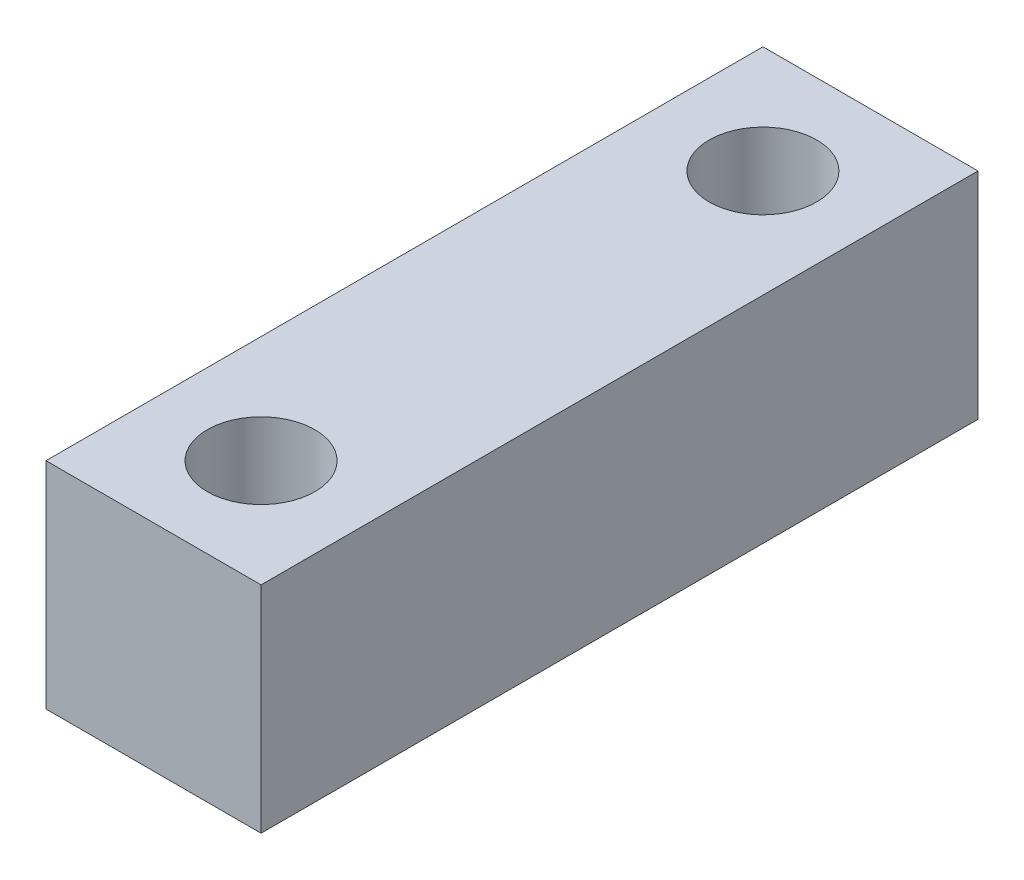
ISO-10303-21;
HEADER;
FILE_DESCRIPTION(('STEP AP214'),'2;1');
FILE_NAME('part.step','',(''),(''),'','','');
FILE_SCHEMA(('AUTOMOTIVE_DESIGN { 1 0 10303 214 1 1 1 1 }'));
ENDSEC;
DATA;
#1=APPLICATION_CONTEXT('core data for automotive mechanical design processes');
#2=APPLICATION_PROTOCOL_DEFINITION('international standard','automotive_design',2000,#1);
#3=PRODUCT_CONTEXT('',#1,'mechanical');
#4=PRODUCT('Part','Part','',(#3));
#5=PRODUCT_RELATED_PRODUCT_CATEGORY('part','',(#4));
#6=PRODUCT_DEFINITION_FORMATION('','',#4);
#7=PRODUCT_DEFINITION_CONTEXT('part definition',#1,'design');
#8=PRODUCT_DEFINITION('design','',#6,#7);
#9=PRODUCT_DEFINITION_SHAPE('','',#8);
#10=(LENGTH_UNIT() NAMED_UNIT(*) SI_UNIT(.MILLI.,.METRE.));
#11=(NAMED_UNIT(*) PLANE_ANGLE_UNIT() SI_UNIT($,.RADIAN.));
#12=(NAMED_UNIT(*) SI_UNIT($,.STERADIAN.) SOLID_ANGLE_UNIT());
#13=UNCERTAINTY_MEASURE_WITH_UNIT(LENGTH_MEASURE(1.E-05),#10,'distance_accuracy_value','');
#14=(GEOMETRIC_REPRESENTATION_CONTEXT(3) GLOBAL_UNCERTAINTY_ASSIGNED_CONTEXT((#13)) GLOBAL_UNIT_ASSIGNED_CONTEXT((#10,
#11,#12)) REPRESENTATION_CONTEXT('',''));
#15=CARTESIAN_POINT('',(0.,0.,0.));
#16=DIRECTION('',(0.,0.,1.));
#17=DIRECTION('',(1.,0.,0.));
#18=AXIS2_PLACEMENT_3D('',#15,#16,#17);
#19=CARTESIAN_POINT('',(15.,-15.,100.));
#20=DIRECTION('',(-1.,0.,0.));
#21=DIRECTION('',(0.,0.,1.));
#22=AXIS2_PLACEMENT_3D('',#19,#20,#21);
#23=PLANE('',#22);
#24=DIRECTION('',(0.,1.,0.));
#25=VECTOR('',#24,1.);
#26=CARTESIAN_POINT('',(15.,-15.,0.));
#27=LINE('',#26,#25);
#28=CARTESIAN_POINT('',(15.,-15.,0.));
#29=VERTEX_POINT('',#28);
#30=CARTESIAN_POINT('',(15.,15.,0.));
#31=VERTEX_POINT('',#30);
#32=EDGE_CURVE('E110',#29,#31,#27,.T.);
#33=ORIENTED_EDGE('',*,*,#32,.T.);
#34=DIRECTION('',(0.,0.,-1.));
#35=VECTOR('',#34,1.);
#36=CARTESIAN_POINT('',(15.,15.,100.));
#37=LINE('',#36,#35);
#38=CARTESIAN_POINT('',(15.,15.,100.));
#39=VERTEX_POINT('',#38);
#40=EDGE_CURVE('E11',#39,#31,#37,.T.);
#41=ORIENTED_EDGE('',*,*,#40,.F.);
#42=DIRECTION('',(0.,1.,0.));
#43=VECTOR('',#42,1.);
#44=CARTESIAN_POINT('',(15.,-15.,100.));
#45=LINE('',#44,#43);
#46=CARTESIAN_POINT('',(15.,-15.,100.));
#47=VERTEX_POINT('',#46);
#48=EDGE_CURVE('E93',#47,#39,#45,.T.);
#49=ORIENTED_EDGE('',*,*,#48,.F.);
#50=DIRECTION('',(0.,0.,-1.));
#51=VECTOR('',#50,1.);
#52=CARTESIAN_POINT('',(15.,-15.,100.));
#53=LINE('',#52,#51);
#54=EDGE_CURVE('E106',#47,#29,#53,.T.);
#55=ORIENTED_EDGE('',*,*,#54,.T.);
#56=EDGE_LOOP('',(#33,#41,#49,#55));
#57=FACE_BOUND('',#56,.T.);
#58=ADVANCED_FACE('F39',(#57),#23,.F.);
#59=CARTESIAN_POINT('',(-15.,15.,100.));
#60=DIRECTION('',(0.,-1.,0.));
#61=DIRECTION('',(0.,0.,-1.));
#62=AXIS2_PLACEMENT_3D('',#59,#60,#61);
#63=PLANE('',#62);
#64=CARTESIAN_POINT('',(0.,15.,15.));
#65=DIRECTION('',(0.,1.,0.));
#66=DIRECTION('',(0.,0.,1.));
#67=AXIS2_PLACEMENT_3D('',#64,#65,#66);
#68=CIRCLE('',#67,7.5);
#69=CARTESIAN_POINT('',(0.,15.,22.5));
#70=VERTEX_POINT('',#69);
#71=EDGE_CURVE('E126',#70,#70,#68,.T.);
#72=ORIENTED_EDGE('',*,*,#71,.F.);
#73=EDGE_LOOP('',(#72));
#74=FACE_BOUND('',#73,.T.);
#75=CARTESIAN_POINT('',(0.,15.,85.));
#76=DIRECTION('',(0.,1.,0.));
#77=DIRECTION('',(0.,0.,1.));
#78=AXIS2_PLACEMENT_3D('',#75,#76,#77);
#79=CIRCLE('',#78,7.5);
#80=CARTESIAN_POINT('',(0.,15.,92.5));
#81=VERTEX_POINT('',#80);
#82=EDGE_CURVE('E133',#81,#81,#79,.T.);
#83=ORIENTED_EDGE('',*,*,#82,.F.);
#84=EDGE_LOOP('',(#83));
#85=FACE_BOUND('',#84,.T.);
#86=DIRECTION('',(-1.,0.,0.));
#87=VECTOR('',#86,1.);
#88=CARTESIAN_POINT('',(-15.,15.,0.));
#89=LINE('',#88,#87);
#90=CARTESIAN_POINT('',(-15.,15.,0.));
#91=VERTEX_POINT('',#90);
#92=EDGE_CURVE('E98',#31,#91,#89,.T.);
#93=ORIENTED_EDGE('',*,*,#92,.T.);
#94=DIRECTION('',(0.,0.,-1.));
#95=VECTOR('',#94,1.);
#96=CARTESIAN_POINT('',(-15.,15.,100.));
#97=LINE('',#96,#95);
#98=CARTESIAN_POINT('',(-15.,15.,100.));
#99=VERTEX_POINT('',#98);
#100=EDGE_CURVE('E49',#99,#91,#97,.T.);
#101=ORIENTED_EDGE('',*,*,#100,.F.);
#102=DIRECTION('',(-1.,0.,0.));
#103=VECTOR('',#102,1.);
#104=CARTESIAN_POINT('',(-15.,15.,100.));
#105=LINE('',#104,#103);
#106=EDGE_CURVE('E88',#39,#99,#105,.T.);
#107=ORIENTED_EDGE('',*,*,#106,.F.);
#108=ORIENTED_EDGE('',*,*,#40,.T.);
#109=EDGE_LOOP('',(#93,#101,#107,#108));
#110=FACE_BOUND('',#109,.T.);
#111=ADVANCED_FACE('F97',(#74,#85,#110),#63,.F.);
#112=CARTESIAN_POINT('',(-15.,-15.,100.));
#113=DIRECTION('',(1.,0.,0.));
#114=DIRECTION('',(0.,0.,-1.));
#115=AXIS2_PLACEMENT_3D('',#112,#113,#114);
#116=PLANE('',#115);
#117=DIRECTION('',(0.,-1.,0.));
#118=VECTOR('',#117,1.);
#119=CARTESIAN_POINT('',(-15.,-15.,0.));
#120=LINE('',#119,#118);
#121=CARTESIAN_POINT('',(-15.,-15.,0.));
#122=VERTEX_POINT('',#121);
#123=EDGE_CURVE('E75',#91,#122,#120,.T.);
#124=ORIENTED_EDGE('',*,*,#123,.T.);
#125=DIRECTION('',(0.,0.,-1.));
#126=VECTOR('',#125,1.);
#127=CARTESIAN_POINT('',(-15.,-15.,100.));
#128=LINE('',#127,#126);
#129=CARTESIAN_POINT('',(-15.,-15.,100.));
#130=VERTEX_POINT('',#129);
#131=EDGE_CURVE('E100',#130,#122,#128,.T.);
#132=ORIENTED_EDGE('',*,*,#131,.F.);
#133=DIRECTION('',(0.,-1.,0.));
#134=VECTOR('',#133,1.);
#135=CARTESIAN_POINT('',(-15.,-15.,100.));
#136=LINE('',#135,#134);
#137=EDGE_CURVE('E91',#99,#130,#136,.T.);
#138=ORIENTED_EDGE('',*,*,#137,.F.);
#139=ORIENTED_EDGE('',*,*,#100,.T.);
#140=EDGE_LOOP('',(#124,#132,#138,#139));
#141=FACE_BOUND('',#140,.T.);
#142=ADVANCED_FACE('F102',(#141),#116,.F.);
#143=CARTESIAN_POINT('',(-15.,-15.,100.));
#144=DIRECTION('',(0.,1.,0.));
#145=DIRECTION('',(0.,0.,1.));
#146=AXIS2_PLACEMENT_3D('',#143,#144,#145);
#147=PLANE('',#146);
#148=CARTESIAN_POINT('',(0.,-15.,15.));
#149=DIRECTION('',(0.,1.,0.));
#150=DIRECTION('',(0.,0.,1.));
#151=AXIS2_PLACEMENT_3D('',#148,#149,#150);
#152=CIRCLE('',#151,7.5);
#153=CARTESIAN_POINT('',(0.,-15.,22.5));
#154=VERTEX_POINT('',#153);
#155=EDGE_CURVE('E42',#154,#154,#152,.T.);
#156=ORIENTED_EDGE('',*,*,#155,.T.);
#157=EDGE_LOOP('',(#156));
#158=FACE_BOUND('',#157,.T.);
#159=CARTESIAN_POINT('',(0.,-15.,85.));
#160=DIRECTION('',(0.,1.,0.));
#161=DIRECTION('',(0.,0.,1.));
#162=AXIS2_PLACEMENT_3D('',#159,#160,#161);
#163=CIRCLE('',#162,7.5);
#164=CARTESIAN_POINT('',(0.,-15.,92.5));
#165=VERTEX_POINT('',#164);
#166=EDGE_CURVE('E123',#165,#165,#163,.T.);
#167=ORIENTED_EDGE('',*,*,#166,.T.);
#168=EDGE_LOOP('',(#167));
#169=FACE_BOUND('',#168,.T.);
#170=DIRECTION('',(1.,0.,0.));
#171=VECTOR('',#170,1.);
#172=CARTESIAN_POINT('',(-15.,-15.,0.));
#173=LINE('',#172,#171);
#174=EDGE_CURVE('E81',#122,#29,#173,.T.);
#175=ORIENTED_EDGE('',*,*,#174,.T.);
#176=ORIENTED_EDGE('',*,*,#54,.F.);
#177=DIRECTION('',(1.,0.,0.));
#178=VECTOR('',#177,1.);
#179=CARTESIAN_POINT('',(-15.,-15.,100.));
#180=LINE('',#179,#178);
#181=EDGE_CURVE('E58',#130,#47,#180,.T.);
#182=ORIENTED_EDGE('',*,*,#181,.F.);
#183=ORIENTED_EDGE('',*,*,#131,.T.);
#184=EDGE_LOOP('',(#175,#176,#182,#183));
#185=FACE_BOUND('',#184,.T.);
#186=ADVANCED_FACE('F152',(#158,#169,#185),#147,.F.);
#187=CARTESIAN_POINT('',(0.,0.,100.));
#188=DIRECTION('',(0.,0.,-1.));
#189=DIRECTION('',(-1.,0.,0.));
#190=AXIS2_PLACEMENT_3D('',#187,#188,#189);
#191=PLANE('',#190);
#192=ORIENTED_EDGE('',*,*,#48,.T.);
#193=ORIENTED_EDGE('',*,*,#106,.T.);
#194=ORIENTED_EDGE('',*,*,#137,.T.);
#195=ORIENTED_EDGE('',*,*,#181,.T.);
#196=EDGE_LOOP('',(#192,#193,#194,#195));
#197=FACE_BOUND('',#196,.T.);
#198=ADVANCED_FACE('F89',(#197),#191,.F.);
#199=CARTESIAN_POINT('',(0.,0.,0.));
#200=DIRECTION('',(0.,0.,-1.));
#201=DIRECTION('',(-1.,0.,0.));
#202=AXIS2_PLACEMENT_3D('',#199,#200,#201);
#203=PLANE('',#202);
#204=ORIENTED_EDGE('',*,*,#32,.F.);
#205=ORIENTED_EDGE('',*,*,#174,.F.);
#206=ORIENTED_EDGE('',*,*,#123,.F.);
#207=ORIENTED_EDGE('',*,*,#92,.F.);
#208=EDGE_LOOP('',(#204,#205,#206,#207));
#209=FACE_BOUND('',#208,.T.);
#210=ADVANCED_FACE('F159',(#209),#203,.T.);
#211=CARTESIAN_POINT('',(0.,-85.,85.));
#212=DIRECTION('',(0.,1.,0.));
#213=DIRECTION('',(0.,0.,1.));
#214=AXIS2_PLACEMENT_3D('',#211,#212,#213);
#215=CYLINDRICAL_SURFACE('',#214,7.5);
#216=ORIENTED_EDGE('',*,*,#82,.T.);
#217=EDGE_LOOP('',(#216));
#218=FACE_BOUND('',#217,.T.);
#219=ORIENTED_EDGE('',*,*,#166,.F.);
#220=EDGE_LOOP('',(#219));
#221=FACE_BOUND('',#220,.T.);
#222=ADVANCED_FACE('F143',(#218,#221),#215,.F.);
#223=CARTESIAN_POINT('',(0.,-85.,15.));
#224=DIRECTION('',(0.,1.,0.));
#225=DIRECTION('',(0.,0.,1.));
#226=AXIS2_PLACEMENT_3D('',#223,#224,#225);
#227=CYLINDRICAL_SURFACE('',#226,7.5);
#228=ORIENTED_EDGE('',*,*,#71,.T.);
#229=EDGE_LOOP('',(#228));
#230=FACE_BOUND('',#229,.T.);
#231=ORIENTED_EDGE('',*,*,#155,.F.);
#232=EDGE_LOOP('',(#231));
#233=FACE_BOUND('',#232,.T.);
#234=ADVANCED_FACE('F167',(#230,#233),#227,.F.);
#235=CLOSED_SHELL('',(#58,#111,#142,#186,#198,#210,#222,#234));
#236=MANIFOLD_SOLID_BREP('B2',#235);
#237=ADVANCED_BREP_SHAPE_REPRESENTATION('',(#18,#236),#14);
#238=SHAPE_DEFINITION_REPRESENTATION(#9,#237);
ENDSEC;
END-ISO-10303-21;
